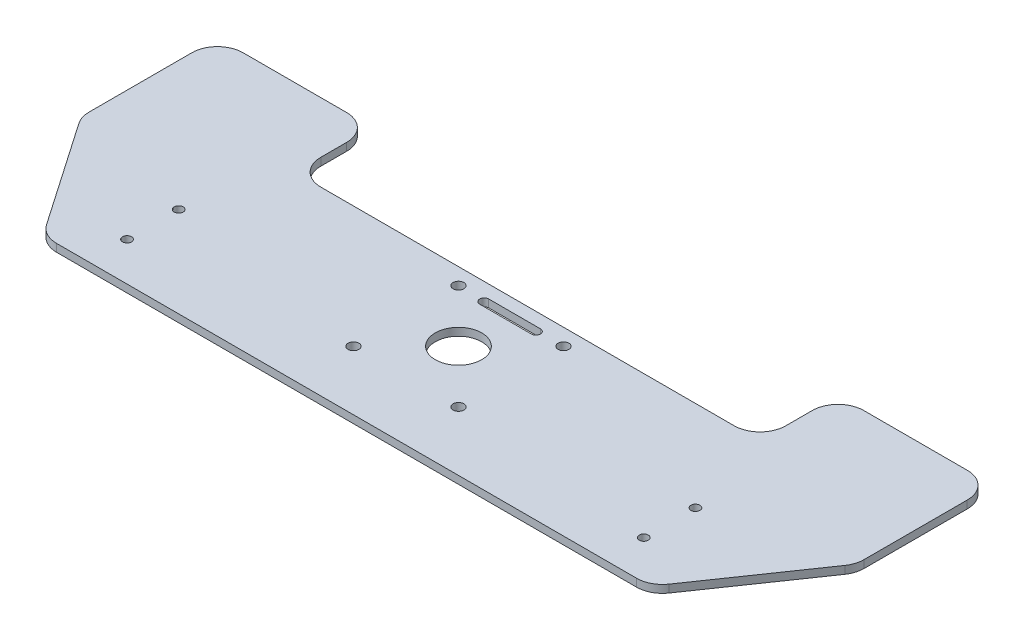
ISO-10303-21;
HEADER;
FILE_DESCRIPTION(('STEP AP214'),'2;1');
FILE_NAME('part.step','',(''),(''),'','','');
FILE_SCHEMA(('AUTOMOTIVE_DESIGN { 1 0 10303 214 1 1 1 1 }'));
ENDSEC;
DATA;
#1=APPLICATION_CONTEXT('core data for automotive mechanical design processes');
#2=APPLICATION_PROTOCOL_DEFINITION('international standard','automotive_design',2000,#1);
#3=PRODUCT_CONTEXT('',#1,'mechanical');
#4=PRODUCT('Part','Part','',(#3));
#5=PRODUCT_RELATED_PRODUCT_CATEGORY('part','',(#4));
#6=PRODUCT_DEFINITION_FORMATION('','',#4);
#7=PRODUCT_DEFINITION_CONTEXT('part definition',#1,'design');
#8=PRODUCT_DEFINITION('design','',#6,#7);
#9=PRODUCT_DEFINITION_SHAPE('','',#8);
#10=(LENGTH_UNIT() NAMED_UNIT(*) SI_UNIT(.MILLI.,.METRE.));
#11=(NAMED_UNIT(*) PLANE_ANGLE_UNIT() SI_UNIT($,.RADIAN.));
#12=(NAMED_UNIT(*) SI_UNIT($,.STERADIAN.) SOLID_ANGLE_UNIT());
#13=UNCERTAINTY_MEASURE_WITH_UNIT(LENGTH_MEASURE(1.E-05),#10,'distance_accuracy_value','');
#14=(GEOMETRIC_REPRESENTATION_CONTEXT(3) GLOBAL_UNCERTAINTY_ASSIGNED_CONTEXT((#13)) GLOBAL_UNIT_ASSIGNED_CONTEXT((#10,
#11,#12)) REPRESENTATION_CONTEXT('',''));
#15=CARTESIAN_POINT('',(0.,0.,0.));
#16=DIRECTION('',(0.,0.,1.));
#17=DIRECTION('',(1.,0.,0.));
#18=AXIS2_PLACEMENT_3D('',#15,#16,#17);
#19=CARTESIAN_POINT('',(112.256301560113,3.,15.0991936427522));
#20=DIRECTION('',(0.,-1.,0.));
#21=DIRECTION('',(0.,0.,-1.));
#22=AXIS2_PLACEMENT_3D('',#19,#20,#21);
#23=CYLINDRICAL_SURFACE('',#22,9.99999999999999);
#24=CARTESIAN_POINT('',(112.256301560113,0.,15.0991936427522));
#25=DIRECTION('',(0.,1.,0.));
#26=DIRECTION('',(0.,0.,-1.));
#27=AXIS2_PLACEMENT_3D('',#24,#25,#26);
#28=CIRCLE('',#27,9.99999999999999);
#29=CARTESIAN_POINT('',(112.256301560113,0.,25.0991936427522));
#30=VERTEX_POINT('',#29);
#31=CARTESIAN_POINT('',(120.492131082074,0.,20.7711520422126));
#32=VERTEX_POINT('',#31);
#33=EDGE_CURVE('E300',#30,#32,#28,.T.);
#34=ORIENTED_EDGE('',*,*,#33,.T.);
#35=DIRECTION('',(0.,-1.,0.));
#36=VECTOR('',#35,1.);
#37=CARTESIAN_POINT('',(120.492131082074,3.,20.7711520422126));
#38=LINE('',#37,#36);
#39=CARTESIAN_POINT('',(120.492131082074,3.,20.7711520422126));
#40=VERTEX_POINT('',#39);
#41=EDGE_CURVE('E11',#40,#32,#38,.T.);
#42=ORIENTED_EDGE('',*,*,#41,.F.);
#43=CARTESIAN_POINT('',(112.256301560113,3.,15.0991936427522));
#44=DIRECTION('',(0.,1.,0.));
#45=DIRECTION('',(0.,0.,-1.));
#46=AXIS2_PLACEMENT_3D('',#43,#44,#45);
#47=CIRCLE('',#46,9.99999999999999);
#48=CARTESIAN_POINT('',(112.256301560113,3.,25.0991936427522));
#49=VERTEX_POINT('',#48);
#50=EDGE_CURVE('E257',#49,#40,#47,.T.);
#51=ORIENTED_EDGE('',*,*,#50,.F.);
#52=DIRECTION('',(0.,-1.,0.));
#53=VECTOR('',#52,1.);
#54=CARTESIAN_POINT('',(112.256301560113,3.,25.0991936427522));
#55=LINE('',#54,#53);
#56=EDGE_CURVE('E299',#49,#30,#55,.T.);
#57=ORIENTED_EDGE('',*,*,#56,.T.);
#58=EDGE_LOOP('',(#34,#42,#51,#57));
#59=FACE_BOUND('',#58,.T.);
#60=ADVANCED_FACE('F43',(#59),#23,.T.);
#61=CARTESIAN_POINT('',(148.23582952196,3.,-19.5134118716057));
#62=DIRECTION('',(-0.823582952196019,0.,-0.567195839946037));
#63=DIRECTION('',(-0.567195839946037,0.,0.823582952196019));
#64=AXIS2_PLACEMENT_3D('',#61,#62,#63);
#65=PLANE('',#64);
#66=DIRECTION('',(0.567195839946037,0.,-0.823582952196019));
#67=VECTOR('',#66,1.);
#68=CARTESIAN_POINT('',(148.23582952196,0.,-19.5134118716057));
#69=LINE('',#68,#67);
#70=CARTESIAN_POINT('',(148.23582952196,0.,-19.5134118716057));
#71=VERTEX_POINT('',#70);
#72=EDGE_CURVE('E303',#32,#71,#69,.T.);
#73=ORIENTED_EDGE('',*,*,#72,.T.);
#74=DIRECTION('',(0.,-1.,0.));
#75=VECTOR('',#74,1.);
#76=CARTESIAN_POINT('',(148.23582952196,3.,-19.5134118716057));
#77=LINE('',#76,#75);
#78=CARTESIAN_POINT('',(148.23582952196,3.,-19.5134118716057));
#79=VERTEX_POINT('',#78);
#80=EDGE_CURVE('E51',#79,#71,#77,.T.);
#81=ORIENTED_EDGE('',*,*,#80,.F.);
#82=DIRECTION('',(0.567195839946037,0.,-0.823582952196019));
#83=VECTOR('',#82,1.);
#84=CARTESIAN_POINT('',(148.23582952196,3.,-19.5134118716057));
#85=LINE('',#84,#83);
#86=EDGE_CURVE('E260',#40,#79,#85,.T.);
#87=ORIENTED_EDGE('',*,*,#86,.F.);
#88=ORIENTED_EDGE('',*,*,#41,.T.);
#89=EDGE_LOOP('',(#73,#81,#87,#88));
#90=FACE_BOUND('',#89,.T.);
#91=ADVANCED_FACE('F516',(#90),#65,.F.);
#92=CARTESIAN_POINT('',(140.,3.,-25.1853702710659));
#93=DIRECTION('',(0.,-1.,0.));
#94=DIRECTION('',(0.,0.,-1.));
#95=AXIS2_PLACEMENT_3D('',#92,#93,#94);
#96=CYLINDRICAL_SURFACE('',#95,10.);
#97=CARTESIAN_POINT('',(140.,0.,-25.1853702710659));
#98=DIRECTION('',(0.,1.,0.));
#99=DIRECTION('',(0.,0.,1.));
#100=AXIS2_PLACEMENT_3D('',#97,#98,#99);
#101=CIRCLE('',#100,10.);
#102=CARTESIAN_POINT('',(150.,0.,-25.1853702710661));
#103=VERTEX_POINT('',#102);
#104=EDGE_CURVE('E306',#71,#103,#101,.T.);
#105=ORIENTED_EDGE('',*,*,#104,.T.);
#106=DIRECTION('',(0.,-1.,0.));
#107=VECTOR('',#106,1.);
#108=CARTESIAN_POINT('',(150.,3.,-25.1853702710661));
#109=LINE('',#108,#107);
#110=CARTESIAN_POINT('',(150.,3.,-25.1853702710661));
#111=VERTEX_POINT('',#110);
#112=EDGE_CURVE('E391',#111,#103,#109,.T.);
#113=ORIENTED_EDGE('',*,*,#112,.F.);
#114=CARTESIAN_POINT('',(140.,3.,-25.1853702710659));
#115=DIRECTION('',(0.,1.,0.));
#116=DIRECTION('',(0.,0.,1.));
#117=AXIS2_PLACEMENT_3D('',#114,#115,#116);
#118=CIRCLE('',#117,10.);
#119=EDGE_CURVE('E263',#79,#111,#118,.T.);
#120=ORIENTED_EDGE('',*,*,#119,.F.);
#121=ORIENTED_EDGE('',*,*,#80,.T.);
#122=EDGE_LOOP('',(#105,#113,#120,#121));
#123=FACE_BOUND('',#122,.T.);
#124=ADVANCED_FACE('F512',(#123),#96,.T.);
#125=CARTESIAN_POINT('',(150.,3.,-25.1853702710661));
#126=DIRECTION('',(-1.,0.,0.));
#127=DIRECTION('',(0.,0.,1.));
#128=AXIS2_PLACEMENT_3D('',#125,#126,#127);
#129=PLANE('',#128);
#130=DIRECTION('',(0.,0.,-1.));
#131=VECTOR('',#130,1.);
#132=CARTESIAN_POINT('',(150.,0.,-25.1853702710661));
#133=LINE('',#132,#131);
#134=CARTESIAN_POINT('',(150.,0.,-64.9999999999999));
#135=VERTEX_POINT('',#134);
#136=EDGE_CURVE('E308',#103,#135,#133,.T.);
#137=ORIENTED_EDGE('',*,*,#136,.T.);
#138=DIRECTION('',(0.,-1.,0.));
#139=VECTOR('',#138,1.);
#140=CARTESIAN_POINT('',(150.,3.,-64.9999999999999));
#141=LINE('',#140,#139);
#142=CARTESIAN_POINT('',(150.,3.,-64.9999999999999));
#143=VERTEX_POINT('',#142);
#144=EDGE_CURVE('E388',#143,#135,#141,.T.);
#145=ORIENTED_EDGE('',*,*,#144,.F.);
#146=DIRECTION('',(0.,0.,-1.));
#147=VECTOR('',#146,1.);
#148=CARTESIAN_POINT('',(150.,3.,-25.1853702710661));
#149=LINE('',#148,#147);
#150=EDGE_CURVE('E265',#111,#143,#149,.T.);
#151=ORIENTED_EDGE('',*,*,#150,.F.);
#152=ORIENTED_EDGE('',*,*,#112,.T.);
#153=EDGE_LOOP('',(#137,#145,#151,#152));
#154=FACE_BOUND('',#153,.T.);
#155=ADVANCED_FACE('F509',(#154),#129,.F.);
#156=CARTESIAN_POINT('',(140.101052956192,3.,-65.1918696109306));
#157=DIRECTION('',(0.,-1.,0.));
#158=DIRECTION('',(0.,0.,-1.));
#159=AXIS2_PLACEMENT_3D('',#156,#157,#158);
#160=CYLINDRICAL_SURFACE('',#159,9.90080635724788);
#161=CARTESIAN_POINT('',(140.101052956192,0.,-65.1918696109306));
#162=DIRECTION('',(0.,1.,0.));
#163=DIRECTION('',(0.,0.,1.));
#164=AXIS2_PLACEMENT_3D('',#161,#162,#163);
#165=CIRCLE('',#164,9.90080635724788);
#166=CARTESIAN_POINT('',(140.101052960808,0.,-75.0926759681785));
#167=VERTEX_POINT('',#166);
#168=EDGE_CURVE('E310',#135,#167,#165,.T.);
#169=ORIENTED_EDGE('',*,*,#168,.T.);
#170=DIRECTION('',(0.,-1.,0.));
#171=VECTOR('',#170,1.);
#172=CARTESIAN_POINT('',(140.101052960808,3.,-75.0926759681785));
#173=LINE('',#172,#171);
#174=CARTESIAN_POINT('',(140.101052960808,3.,-75.0926759681785));
#175=VERTEX_POINT('',#174);
#176=EDGE_CURVE('E385',#175,#167,#173,.T.);
#177=ORIENTED_EDGE('',*,*,#176,.F.);
#178=CARTESIAN_POINT('',(140.101052956192,3.,-65.1918696109306));
#179=DIRECTION('',(0.,1.,0.));
#180=DIRECTION('',(0.,0.,1.));
#181=AXIS2_PLACEMENT_3D('',#178,#179,#180);
#182=CIRCLE('',#181,9.90080635724788);
#183=EDGE_CURVE('E267',#143,#175,#182,.T.);
#184=ORIENTED_EDGE('',*,*,#183,.F.);
#185=ORIENTED_EDGE('',*,*,#144,.T.);
#186=EDGE_LOOP('',(#169,#177,#184,#185));
#187=FACE_BOUND('',#186,.T.);
#188=ADVANCED_FACE('F505',(#187),#160,.T.);
#189=CARTESIAN_POINT('',(140.101052960808,3.,-75.0926759681785));
#190=DIRECTION('',(0.,0.,1.));
#191=DIRECTION('',(1.,0.,0.));
#192=AXIS2_PLACEMENT_3D('',#189,#190,#191);
#193=PLANE('',#192);
#194=DIRECTION('',(-1.,0.,0.));
#195=VECTOR('',#194,1.);
#196=CARTESIAN_POINT('',(140.101052960808,0.,-75.0926759681785));
#197=LINE('',#196,#195);
#198=CARTESIAN_POINT('',(100.001859318056,0.,-75.0926759681785));
#199=VERTEX_POINT('',#198);
#200=EDGE_CURVE('E312',#167,#199,#197,.T.);
#201=ORIENTED_EDGE('',*,*,#200,.T.);
#202=DIRECTION('',(0.,-1.,0.));
#203=VECTOR('',#202,1.);
#204=CARTESIAN_POINT('',(100.001859318056,3.,-75.0926759681785));
#205=LINE('',#204,#203);
#206=CARTESIAN_POINT('',(100.001859318056,3.,-75.0926759681785));
#207=VERTEX_POINT('',#206);
#208=EDGE_CURVE('E382',#207,#199,#205,.T.);
#209=ORIENTED_EDGE('',*,*,#208,.F.);
#210=DIRECTION('',(-1.,0.,0.));
#211=VECTOR('',#210,1.);
#212=CARTESIAN_POINT('',(140.101052960808,3.,-75.0926759681785));
#213=LINE('',#212,#211);
#214=EDGE_CURVE('E269',#175,#207,#213,.T.);
#215=ORIENTED_EDGE('',*,*,#214,.F.);
#216=ORIENTED_EDGE('',*,*,#176,.T.);
#217=EDGE_LOOP('',(#201,#209,#215,#216));
#218=FACE_BOUND('',#217,.T.);
#219=ADVANCED_FACE('F500',(#218),#193,.F.);
#220=CARTESIAN_POINT('',(99.9981591200433,3.,-65.0926766527517));
#221=DIRECTION('',(0.,-1.,0.));
#222=DIRECTION('',(0.,0.,-1.));
#223=AXIS2_PLACEMENT_3D('',#220,#221,#222);
#224=CYLINDRICAL_SURFACE('',#223,10.);
#225=CARTESIAN_POINT('',(99.9981591200433,0.,-65.0926766527517));
#226=DIRECTION('',(0.,1.,0.));
#227=DIRECTION('',(0.,0.,-1.));
#228=AXIS2_PLACEMENT_3D('',#225,#226,#227);
#229=CIRCLE('',#228,10.);
#230=CARTESIAN_POINT('',(90.,0.,-64.9008063572478));
#231=VERTEX_POINT('',#230);
#232=EDGE_CURVE('E314',#199,#231,#229,.T.);
#233=ORIENTED_EDGE('',*,*,#232,.T.);
#234=DIRECTION('',(0.,-1.,0.));
#235=VECTOR('',#234,1.);
#236=CARTESIAN_POINT('',(90.,3.,-64.9008063572478));
#237=LINE('',#236,#235);
#238=CARTESIAN_POINT('',(90.,3.,-64.9008063572478));
#239=VERTEX_POINT('',#238);
#240=EDGE_CURVE('E379',#239,#231,#237,.T.);
#241=ORIENTED_EDGE('',*,*,#240,.F.);
#242=CARTESIAN_POINT('',(99.9981591200433,3.,-65.0926766527517));
#243=DIRECTION('',(0.,1.,0.));
#244=DIRECTION('',(0.,0.,-1.));
#245=AXIS2_PLACEMENT_3D('',#242,#243,#244);
#246=CIRCLE('',#245,10.);
#247=EDGE_CURVE('E271',#207,#239,#246,.T.);
#248=ORIENTED_EDGE('',*,*,#247,.F.);
#249=ORIENTED_EDGE('',*,*,#208,.T.);
#250=EDGE_LOOP('',(#233,#241,#248,#249));
#251=FACE_BOUND('',#250,.T.);
#252=ADVANCED_FACE('F494',(#251),#224,.T.);
#253=CARTESIAN_POINT('',(90.,3.,-64.9008063572478));
#254=DIRECTION('',(1.,0.,0.));
#255=DIRECTION('',(0.,0.,-1.));
#256=AXIS2_PLACEMENT_3D('',#253,#254,#255);
#257=PLANE('',#256);
#258=DIRECTION('',(0.,0.,1.));
#259=VECTOR('',#258,1.);
#260=CARTESIAN_POINT('',(90.,0.,-64.9008063572478));
#261=LINE('',#260,#259);
#262=CARTESIAN_POINT('',(90.,0.,-54.9008063572479));
#263=VERTEX_POINT('',#262);
#264=EDGE_CURVE('E316',#231,#263,#261,.T.);
#265=ORIENTED_EDGE('',*,*,#264,.T.);
#266=DIRECTION('',(0.,-1.,0.));
#267=VECTOR('',#266,1.);
#268=CARTESIAN_POINT('',(90.,3.,-54.9008063572479));
#269=LINE('',#268,#267);
#270=CARTESIAN_POINT('',(90.,3.,-54.9008063572479));
#271=VERTEX_POINT('',#270);
#272=EDGE_CURVE('E376',#271,#263,#269,.T.);
#273=ORIENTED_EDGE('',*,*,#272,.F.);
#274=DIRECTION('',(0.,0.,1.));
#275=VECTOR('',#274,1.);
#276=CARTESIAN_POINT('',(90.,3.,-64.9008063572478));
#277=LINE('',#276,#275);
#278=EDGE_CURVE('E273',#239,#271,#277,.T.);
#279=ORIENTED_EDGE('',*,*,#278,.F.);
#280=ORIENTED_EDGE('',*,*,#240,.T.);
#281=EDGE_LOOP('',(#265,#273,#279,#280));
#282=FACE_BOUND('',#281,.T.);
#283=ADVANCED_FACE('F490',(#282),#257,.F.);
#284=CARTESIAN_POINT('',(80.,3.,-54.9008063572479));
#285=DIRECTION('',(0.,-1.,0.));
#286=DIRECTION('',(0.,0.,-1.));
#287=AXIS2_PLACEMENT_3D('',#284,#285,#286);
#288=CYLINDRICAL_SURFACE('',#287,10.);
#289=CARTESIAN_POINT('',(80.,0.,-54.9008063572479));
#290=DIRECTION('',(0.,-1.,0.));
#291=DIRECTION('',(0.,0.,-1.));
#292=AXIS2_PLACEMENT_3D('',#289,#290,#291);
#293=CIRCLE('',#292,10.);
#294=CARTESIAN_POINT('',(80.,0.,-44.9008063572478));
#295=VERTEX_POINT('',#294);
#296=EDGE_CURVE('E318',#263,#295,#293,.T.);
#297=ORIENTED_EDGE('',*,*,#296,.T.);
#298=DIRECTION('',(0.,-1.,0.));
#299=VECTOR('',#298,1.);
#300=CARTESIAN_POINT('',(80.,3.,-44.9008063572478));
#301=LINE('',#300,#299);
#302=CARTESIAN_POINT('',(80.,3.,-44.9008063572478));
#303=VERTEX_POINT('',#302);
#304=EDGE_CURVE('E373',#303,#295,#301,.T.);
#305=ORIENTED_EDGE('',*,*,#304,.F.);
#306=CARTESIAN_POINT('',(80.,3.,-54.9008063572479));
#307=DIRECTION('',(0.,-1.,0.));
#308=DIRECTION('',(0.,0.,-1.));
#309=AXIS2_PLACEMENT_3D('',#306,#307,#308);
#310=CIRCLE('',#309,10.);
#311=EDGE_CURVE('E275',#271,#303,#310,.T.);
#312=ORIENTED_EDGE('',*,*,#311,.F.);
#313=ORIENTED_EDGE('',*,*,#272,.T.);
#314=EDGE_LOOP('',(#297,#305,#312,#313));
#315=FACE_BOUND('',#314,.T.);
#316=ADVANCED_FACE('F485',(#315),#288,.F.);
#317=CARTESIAN_POINT('',(-79.9999999999999,3.,-44.9008063572478));
#318=DIRECTION('',(0.,0.,1.));
#319=DIRECTION('',(1.,0.,0.));
#320=AXIS2_PLACEMENT_3D('',#317,#318,#319);
#321=PLANE('',#320);
#322=DIRECTION('',(-1.,0.,0.));
#323=VECTOR('',#322,1.);
#324=CARTESIAN_POINT('',(-79.9999999999999,0.,-44.9008063572478));
#325=LINE('',#324,#323);
#326=CARTESIAN_POINT('',(-79.9999999999999,0.,-44.9008063572478));
#327=VERTEX_POINT('',#326);
#328=EDGE_CURVE('E320',#295,#327,#325,.T.);
#329=ORIENTED_EDGE('',*,*,#328,.T.);
#330=DIRECTION('',(0.,-1.,0.));
#331=VECTOR('',#330,1.);
#332=CARTESIAN_POINT('',(-79.9999999999999,3.,-44.9008063572478));
#333=LINE('',#332,#331);
#334=CARTESIAN_POINT('',(-79.9999999999999,3.,-44.9008063572478));
#335=VERTEX_POINT('',#334);
#336=EDGE_CURVE('E370',#335,#327,#333,.T.);
#337=ORIENTED_EDGE('',*,*,#336,.F.);
#338=DIRECTION('',(-1.,0.,0.));
#339=VECTOR('',#338,1.);
#340=CARTESIAN_POINT('',(-79.9999999999999,3.,-44.9008063572478));
#341=LINE('',#340,#339);
#342=EDGE_CURVE('E277',#303,#335,#341,.T.);
#343=ORIENTED_EDGE('',*,*,#342,.F.);
#344=ORIENTED_EDGE('',*,*,#304,.T.);
#345=EDGE_LOOP('',(#329,#337,#343,#344));
#346=FACE_BOUND('',#345,.T.);
#347=ADVANCED_FACE('F479',(#346),#321,.F.);
#348=CARTESIAN_POINT('',(-79.9999999999999,3.,-54.9008063572479));
#349=DIRECTION('',(0.,-1.,0.));
#350=DIRECTION('',(0.,0.,-1.));
#351=AXIS2_PLACEMENT_3D('',#348,#349,#350);
#352=CYLINDRICAL_SURFACE('',#351,10.);
#353=CARTESIAN_POINT('',(-79.9999999999999,0.,-54.9008063572479));
#354=DIRECTION('',(0.,-1.,0.));
#355=DIRECTION('',(0.,0.,1.));
#356=AXIS2_PLACEMENT_3D('',#353,#354,#355);
#357=CIRCLE('',#356,10.);
#358=CARTESIAN_POINT('',(-90.,0.,-54.9008063572479));
#359=VERTEX_POINT('',#358);
#360=EDGE_CURVE('E322',#327,#359,#357,.T.);
#361=ORIENTED_EDGE('',*,*,#360,.T.);
#362=DIRECTION('',(0.,-1.,0.));
#363=VECTOR('',#362,1.);
#364=CARTESIAN_POINT('',(-90.,3.,-54.9008063572479));
#365=LINE('',#364,#363);
#366=CARTESIAN_POINT('',(-90.,3.,-54.9008063572479));
#367=VERTEX_POINT('',#366);
#368=EDGE_CURVE('E367',#367,#359,#365,.T.);
#369=ORIENTED_EDGE('',*,*,#368,.F.);
#370=CARTESIAN_POINT('',(-79.9999999999999,3.,-54.9008063572479));
#371=DIRECTION('',(0.,-1.,0.));
#372=DIRECTION('',(0.,0.,1.));
#373=AXIS2_PLACEMENT_3D('',#370,#371,#372);
#374=CIRCLE('',#373,10.);
#375=EDGE_CURVE('E279',#335,#367,#374,.T.);
#376=ORIENTED_EDGE('',*,*,#375,.F.);
#377=ORIENTED_EDGE('',*,*,#336,.T.);
#378=EDGE_LOOP('',(#361,#369,#376,#377));
#379=FACE_BOUND('',#378,.T.);
#380=ADVANCED_FACE('F475',(#379),#352,.F.);
#381=CARTESIAN_POINT('',(-90.,3.,-64.9008063572478));
#382=DIRECTION('',(-1.,0.,0.));
#383=DIRECTION('',(0.,0.,1.));
#384=AXIS2_PLACEMENT_3D('',#381,#382,#383);
#385=PLANE('',#384);
#386=DIRECTION('',(0.,0.,-1.));
#387=VECTOR('',#386,1.);
#388=CARTESIAN_POINT('',(-90.,0.,-64.9008063572478));
#389=LINE('',#388,#387);
#390=CARTESIAN_POINT('',(-90.,0.,-64.9008063572478));
#391=VERTEX_POINT('',#390);
#392=EDGE_CURVE('E324',#359,#391,#389,.T.);
#393=ORIENTED_EDGE('',*,*,#392,.T.);
#394=DIRECTION('',(0.,-1.,0.));
#395=VECTOR('',#394,1.);
#396=CARTESIAN_POINT('',(-90.,3.,-64.9008063572478));
#397=LINE('',#396,#395);
#398=CARTESIAN_POINT('',(-90.,3.,-64.9008063572478));
#399=VERTEX_POINT('',#398);
#400=EDGE_CURVE('E364',#399,#391,#397,.T.);
#401=ORIENTED_EDGE('',*,*,#400,.F.);
#402=DIRECTION('',(0.,0.,-1.));
#403=VECTOR('',#402,1.);
#404=CARTESIAN_POINT('',(-90.,3.,-64.9008063572478));
#405=LINE('',#404,#403);
#406=EDGE_CURVE('E281',#367,#399,#405,.T.);
#407=ORIENTED_EDGE('',*,*,#406,.F.);
#408=ORIENTED_EDGE('',*,*,#368,.T.);
#409=EDGE_LOOP('',(#393,#401,#407,#408));
#410=FACE_BOUND('',#409,.T.);
#411=ADVANCED_FACE('F470',(#410),#385,.F.);
#412=CARTESIAN_POINT('',(-100.,3.,-64.9008063572478));
#413=DIRECTION('',(0.,-1.,0.));
#414=DIRECTION('',(0.,0.,-1.));
#415=AXIS2_PLACEMENT_3D('',#412,#413,#414);
#416=CYLINDRICAL_SURFACE('',#415,10.);
#417=CARTESIAN_POINT('',(-100.,0.,-64.9008063572478));
#418=DIRECTION('',(0.,1.,0.));
#419=DIRECTION('',(0.,0.,1.));
#420=AXIS2_PLACEMENT_3D('',#417,#418,#419);
#421=CIRCLE('',#420,10.);
#422=CARTESIAN_POINT('',(-100.,0.,-74.9008063572478));
#423=VERTEX_POINT('',#422);
#424=EDGE_CURVE('E326',#391,#423,#421,.T.);
#425=ORIENTED_EDGE('',*,*,#424,.T.);
#426=DIRECTION('',(0.,-1.,0.));
#427=VECTOR('',#426,1.);
#428=CARTESIAN_POINT('',(-100.,3.,-74.9008063572478));
#429=LINE('',#428,#427);
#430=CARTESIAN_POINT('',(-100.,3.,-74.9008063572478));
#431=VERTEX_POINT('',#430);
#432=EDGE_CURVE('E361',#431,#423,#429,.T.);
#433=ORIENTED_EDGE('',*,*,#432,.F.);
#434=CARTESIAN_POINT('',(-100.,3.,-64.9008063572478));
#435=DIRECTION('',(0.,1.,0.));
#436=DIRECTION('',(0.,0.,1.));
#437=AXIS2_PLACEMENT_3D('',#434,#435,#436);
#438=CIRCLE('',#437,10.);
#439=EDGE_CURVE('E283',#399,#431,#438,.T.);
#440=ORIENTED_EDGE('',*,*,#439,.F.);
#441=ORIENTED_EDGE('',*,*,#400,.T.);
#442=EDGE_LOOP('',(#425,#433,#440,#441));
#443=FACE_BOUND('',#442,.T.);
#444=ADVANCED_FACE('F464',(#443),#416,.T.);
#445=CARTESIAN_POINT('',(-140.099193642752,3.,-74.9008063572478));
#446=DIRECTION('',(0.,0.,1.));
#447=DIRECTION('',(1.,0.,0.));
#448=AXIS2_PLACEMENT_3D('',#445,#446,#447);
#449=PLANE('',#448);
#450=DIRECTION('',(-1.,0.,0.));
#451=VECTOR('',#450,1.);
#452=CARTESIAN_POINT('',(-140.099193642752,0.,-74.9008063572478));
#453=LINE('',#452,#451);
#454=CARTESIAN_POINT('',(-140.099193642752,0.,-74.9008063572478));
#455=VERTEX_POINT('',#454);
#456=EDGE_CURVE('E328',#423,#455,#453,.T.);
#457=ORIENTED_EDGE('',*,*,#456,.T.);
#458=DIRECTION('',(0.,-1.,0.));
#459=VECTOR('',#458,1.);
#460=CARTESIAN_POINT('',(-140.099193642752,3.,-74.9008063572478));
#461=LINE('',#460,#459);
#462=CARTESIAN_POINT('',(-140.099193642752,3.,-74.9008063572478));
#463=VERTEX_POINT('',#462);
#464=EDGE_CURVE('E358',#463,#455,#461,.T.);
#465=ORIENTED_EDGE('',*,*,#464,.F.);
#466=DIRECTION('',(-1.,0.,0.));
#467=VECTOR('',#466,1.);
#468=CARTESIAN_POINT('',(-140.099193642752,3.,-74.9008063572478));
#469=LINE('',#468,#467);
#470=EDGE_CURVE('E285',#431,#463,#469,.T.);
#471=ORIENTED_EDGE('',*,*,#470,.F.);
#472=ORIENTED_EDGE('',*,*,#432,.T.);
#473=EDGE_LOOP('',(#457,#465,#471,#472));
#474=FACE_BOUND('',#473,.T.);
#475=ADVANCED_FACE('F460',(#474),#449,.F.);
#476=CARTESIAN_POINT('',(-140.099193642752,3.,-64.9999999999999));
#477=DIRECTION('',(0.,-1.,0.));
#478=DIRECTION('',(0.,0.,-1.));
#479=AXIS2_PLACEMENT_3D('',#476,#477,#478);
#480=CYLINDRICAL_SURFACE('',#479,9.90080635724788);
#481=CARTESIAN_POINT('',(-140.099193642752,0.,-64.9999999999999));
#482=DIRECTION('',(0.,1.,0.));
#483=DIRECTION('',(0.,0.,-1.));
#484=AXIS2_PLACEMENT_3D('',#481,#482,#483);
#485=CIRCLE('',#484,9.90080635724788);
#486=CARTESIAN_POINT('',(-150.,0.,-64.9999999999999));
#487=VERTEX_POINT('',#486);
#488=EDGE_CURVE('E330',#455,#487,#485,.T.);
#489=ORIENTED_EDGE('',*,*,#488,.T.);
#490=DIRECTION('',(0.,-1.,0.));
#491=VECTOR('',#490,1.);
#492=CARTESIAN_POINT('',(-150.,3.,-64.9999999999999));
#493=LINE('',#492,#491);
#494=CARTESIAN_POINT('',(-150.,3.,-64.9999999999999));
#495=VERTEX_POINT('',#494);
#496=EDGE_CURVE('E355',#495,#487,#493,.T.);
#497=ORIENTED_EDGE('',*,*,#496,.F.);
#498=CARTESIAN_POINT('',(-140.099193642752,3.,-64.9999999999999));
#499=DIRECTION('',(0.,1.,0.));
#500=DIRECTION('',(0.,0.,-1.));
#501=AXIS2_PLACEMENT_3D('',#498,#499,#500);
#502=CIRCLE('',#501,9.90080635724788);
#503=EDGE_CURVE('E287',#463,#495,#502,.T.);
#504=ORIENTED_EDGE('',*,*,#503,.F.);
#505=ORIENTED_EDGE('',*,*,#464,.T.);
#506=EDGE_LOOP('',(#489,#497,#504,#505));
#507=FACE_BOUND('',#506,.T.);
#508=ADVANCED_FACE('F455',(#507),#480,.T.);
#509=CARTESIAN_POINT('',(-150.,3.,-25.1853702710662));
#510=DIRECTION('',(1.,0.,0.));
#511=DIRECTION('',(0.,0.,-1.));
#512=AXIS2_PLACEMENT_3D('',#509,#510,#511);
#513=PLANE('',#512);
#514=DIRECTION('',(0.,0.,1.));
#515=VECTOR('',#514,1.);
#516=CARTESIAN_POINT('',(-150.,0.,-25.1853702710662));
#517=LINE('',#516,#515);
#518=CARTESIAN_POINT('',(-150.,0.,-25.1853702710662));
#519=VERTEX_POINT('',#518);
#520=EDGE_CURVE('E332',#487,#519,#517,.T.);
#521=ORIENTED_EDGE('',*,*,#520,.T.);
#522=DIRECTION('',(0.,-1.,0.));
#523=VECTOR('',#522,1.);
#524=CARTESIAN_POINT('',(-150.,3.,-25.1853702710662));
#525=LINE('',#524,#523);
#526=CARTESIAN_POINT('',(-150.,3.,-25.1853702710662));
#527=VERTEX_POINT('',#526);
#528=EDGE_CURVE('E352',#527,#519,#525,.T.);
#529=ORIENTED_EDGE('',*,*,#528,.F.);
#530=DIRECTION('',(0.,0.,1.));
#531=VECTOR('',#530,1.);
#532=CARTESIAN_POINT('',(-150.,3.,-25.1853702710662));
#533=LINE('',#532,#531);
#534=EDGE_CURVE('E289',#495,#527,#533,.T.);
#535=ORIENTED_EDGE('',*,*,#534,.F.);
#536=ORIENTED_EDGE('',*,*,#496,.T.);
#537=EDGE_LOOP('',(#521,#529,#535,#536));
#538=FACE_BOUND('',#537,.T.);
#539=ADVANCED_FACE('F449',(#538),#513,.F.);
#540=CARTESIAN_POINT('',(-140.,3.,-25.1853702710662));
#541=DIRECTION('',(0.,-1.,0.));
#542=DIRECTION('',(0.,0.,-1.));
#543=AXIS2_PLACEMENT_3D('',#540,#541,#542);
#544=CYLINDRICAL_SURFACE('',#543,10.);
#545=CARTESIAN_POINT('',(-140.,0.,-25.1853702710662));
#546=DIRECTION('',(0.,1.,0.));
#547=DIRECTION('',(0.,0.,-1.));
#548=AXIS2_PLACEMENT_3D('',#545,#546,#547);
#549=CIRCLE('',#548,10.);
#550=CARTESIAN_POINT('',(-148.23582952196,0.,-19.5134118716058));
#551=VERTEX_POINT('',#550);
#552=EDGE_CURVE('E334',#519,#551,#549,.T.);
#553=ORIENTED_EDGE('',*,*,#552,.T.);
#554=DIRECTION('',(0.,-1.,0.));
#555=VECTOR('',#554,1.);
#556=CARTESIAN_POINT('',(-148.23582952196,3.,-19.5134118716058));
#557=LINE('',#556,#555);
#558=CARTESIAN_POINT('',(-148.23582952196,3.,-19.5134118716058));
#559=VERTEX_POINT('',#558);
#560=EDGE_CURVE('E349',#559,#551,#557,.T.);
#561=ORIENTED_EDGE('',*,*,#560,.F.);
#562=CARTESIAN_POINT('',(-140.,3.,-25.1853702710662));
#563=DIRECTION('',(0.,1.,0.));
#564=DIRECTION('',(0.,0.,-1.));
#565=AXIS2_PLACEMENT_3D('',#562,#563,#564);
#566=CIRCLE('',#565,10.);
#567=EDGE_CURVE('E291',#527,#559,#566,.T.);
#568=ORIENTED_EDGE('',*,*,#567,.F.);
#569=ORIENTED_EDGE('',*,*,#528,.T.);
#570=EDGE_LOOP('',(#553,#561,#568,#569));
#571=FACE_BOUND('',#570,.T.);
#572=ADVANCED_FACE('F445',(#571),#544,.T.);
#573=CARTESIAN_POINT('',(-148.23582952196,3.,-19.5134118716058));
#574=DIRECTION('',(0.82358295219602,0.,-0.567195839946035));
#575=DIRECTION('',(-0.567195839946035,0.,-0.82358295219602));
#576=AXIS2_PLACEMENT_3D('',#573,#574,#575);
#577=PLANE('',#576);
#578=DIRECTION('',(0.567195839946035,0.,0.82358295219602));
#579=VECTOR('',#578,1.);
#580=CARTESIAN_POINT('',(-148.23582952196,0.,-19.5134118716058));
#581=LINE('',#580,#579);
#582=CARTESIAN_POINT('',(-120.492131082074,0.,20.7711520422125));
#583=VERTEX_POINT('',#582);
#584=EDGE_CURVE('E336',#551,#583,#581,.T.);
#585=ORIENTED_EDGE('',*,*,#584,.T.);
#586=DIRECTION('',(0.,-1.,0.));
#587=VECTOR('',#586,1.);
#588=CARTESIAN_POINT('',(-120.492131082074,3.,20.7711520422125));
#589=LINE('',#588,#587);
#590=CARTESIAN_POINT('',(-120.492131082074,3.,20.7711520422125));
#591=VERTEX_POINT('',#590);
#592=EDGE_CURVE('E346',#591,#583,#589,.T.);
#593=ORIENTED_EDGE('',*,*,#592,.F.);
#594=DIRECTION('',(0.567195839946035,0.,0.82358295219602));
#595=VECTOR('',#594,1.);
#596=CARTESIAN_POINT('',(-148.23582952196,3.,-19.5134118716058));
#597=LINE('',#596,#595);
#598=EDGE_CURVE('E293',#559,#591,#597,.T.);
#599=ORIENTED_EDGE('',*,*,#598,.F.);
#600=ORIENTED_EDGE('',*,*,#560,.T.);
#601=EDGE_LOOP('',(#585,#593,#599,#600));
#602=FACE_BOUND('',#601,.T.);
#603=ADVANCED_FACE('F440',(#602),#577,.F.);
#604=CARTESIAN_POINT('',(-112.256301560113,3.,15.0991936427522));
#605=DIRECTION('',(0.,-1.,0.));
#606=DIRECTION('',(0.,0.,-1.));
#607=AXIS2_PLACEMENT_3D('',#604,#605,#606);
#608=CYLINDRICAL_SURFACE('',#607,10.);
#609=CARTESIAN_POINT('',(-112.256301560113,0.,15.0991936427522));
#610=DIRECTION('',(0.,1.,0.));
#611=DIRECTION('',(0.,0.,1.));
#612=AXIS2_PLACEMENT_3D('',#609,#610,#611);
#613=CIRCLE('',#612,10.);
#614=CARTESIAN_POINT('',(-112.256301560113,0.,25.0991936427522));
#615=VERTEX_POINT('',#614);
#616=EDGE_CURVE('E338',#583,#615,#613,.T.);
#617=ORIENTED_EDGE('',*,*,#616,.T.);
#618=DIRECTION('',(0.,-1.,0.));
#619=VECTOR('',#618,1.);
#620=CARTESIAN_POINT('',(-112.256301560113,3.,25.0991936427522));
#621=LINE('',#620,#619);
#622=CARTESIAN_POINT('',(-112.256301560113,3.,25.0991936427522));
#623=VERTEX_POINT('',#622);
#624=EDGE_CURVE('E343',#623,#615,#621,.T.);
#625=ORIENTED_EDGE('',*,*,#624,.F.);
#626=CARTESIAN_POINT('',(-112.256301560113,3.,15.0991936427522));
#627=DIRECTION('',(0.,1.,0.));
#628=DIRECTION('',(0.,0.,1.));
#629=AXIS2_PLACEMENT_3D('',#626,#627,#628);
#630=CIRCLE('',#629,10.);
#631=EDGE_CURVE('E295',#591,#623,#630,.T.);
#632=ORIENTED_EDGE('',*,*,#631,.F.);
#633=ORIENTED_EDGE('',*,*,#592,.T.);
#634=EDGE_LOOP('',(#617,#625,#632,#633));
#635=FACE_BOUND('',#634,.T.);
#636=ADVANCED_FACE('F434',(#635),#608,.T.);
#637=CARTESIAN_POINT('',(-112.256301560113,3.,25.0991936427522));
#638=DIRECTION('',(0.,0.,-1.));
#639=DIRECTION('',(-1.,0.,0.));
#640=AXIS2_PLACEMENT_3D('',#637,#638,#639);
#641=PLANE('',#640);
#642=DIRECTION('',(1.,0.,0.));
#643=VECTOR('',#642,1.);
#644=CARTESIAN_POINT('',(-112.256301560113,0.,25.0991936427522));
#645=LINE('',#644,#643);
#646=EDGE_CURVE('E261',#615,#30,#645,.T.);
#647=ORIENTED_EDGE('',*,*,#646,.T.);
#648=ORIENTED_EDGE('',*,*,#56,.F.);
#649=DIRECTION('',(1.,0.,0.));
#650=VECTOR('',#649,1.);
#651=CARTESIAN_POINT('',(-112.256301560113,3.,25.0991936427522));
#652=LINE('',#651,#650);
#653=EDGE_CURVE('E297',#623,#49,#652,.T.);
#654=ORIENTED_EDGE('',*,*,#653,.F.);
#655=ORIENTED_EDGE('',*,*,#624,.T.);
#656=EDGE_LOOP('',(#647,#648,#654,#655));
#657=FACE_BOUND('',#656,.T.);
#658=ADVANCED_FACE('F430',(#657),#641,.F.);
#659=CARTESIAN_POINT('',(112.256301560113,3.,15.0991936427522));
#660=DIRECTION('',(0.,-1.,0.));
#661=DIRECTION('',(0.,0.,-1.));
#662=AXIS2_PLACEMENT_3D('',#659,#660,#661);
#663=PLANE('',#662);
#664=CARTESIAN_POINT('',(-20.3234595783914,3.,-38.5085371831278));
#665=DIRECTION('',(0.,-1.,0.));
#666=DIRECTION('',(0.,0.,-1.));
#667=AXIS2_PLACEMENT_3D('',#664,#665,#666);
#668=CIRCLE('',#667,2.1);
#669=CARTESIAN_POINT('',(-20.3234595783914,3.,-40.6085371831278));
#670=VERTEX_POINT('',#669);
#671=EDGE_CURVE('E890',#670,#670,#668,.T.);
#672=ORIENTED_EDGE('',*,*,#671,.T.);
#673=EDGE_LOOP('',(#672));
#674=FACE_BOUND('',#673,.T.);
#675=CARTESIAN_POINT('',(20.3234595783921,3.,-38.5085371831277));
#676=DIRECTION('',(0.,-1.,0.));
#677=DIRECTION('',(0.,0.,-1.));
#678=AXIS2_PLACEMENT_3D('',#675,#676,#677);
#679=CIRCLE('',#678,2.1);
#680=CARTESIAN_POINT('',(20.3234595783921,3.,-40.6085371831277));
#681=VERTEX_POINT('',#680);
#682=EDGE_CURVE('E891',#681,#681,#679,.T.);
#683=ORIENTED_EDGE('',*,*,#682,.T.);
#684=EDGE_LOOP('',(#683));
#685=FACE_BOUND('',#684,.T.);
#686=CARTESIAN_POINT('',(20.3234595783919,3.,2.13838197365574));
#687=DIRECTION('',(0.,-1.,0.));
#688=DIRECTION('',(0.,0.,-1.));
#689=AXIS2_PLACEMENT_3D('',#686,#687,#688);
#690=CIRCLE('',#689,2.1);
#691=CARTESIAN_POINT('',(20.3234595783919,3.,0.0383819736557399));
#692=VERTEX_POINT('',#691);
#693=EDGE_CURVE('E894',#692,#692,#690,.T.);
#694=ORIENTED_EDGE('',*,*,#693,.T.);
#695=EDGE_LOOP('',(#694));
#696=FACE_BOUND('',#695,.T.);
#697=CARTESIAN_POINT('',(-20.3234595783916,3.,2.13838197365542));
#698=DIRECTION('',(0.,-1.,0.));
#699=DIRECTION('',(0.,0.,-1.));
#700=AXIS2_PLACEMENT_3D('',#697,#698,#699);
#701=CIRCLE('',#700,2.1);
#702=CARTESIAN_POINT('',(-20.3234595783916,3.,0.0383819736554211));
#703=VERTEX_POINT('',#702);
#704=EDGE_CURVE('E899',#703,#703,#701,.T.);
#705=ORIENTED_EDGE('',*,*,#704,.T.);
#706=EDGE_LOOP('',(#705));
#707=FACE_BOUND('',#706,.T.);
#708=CARTESIAN_POINT('',(-2.74736830507827E-12,3.,-18.185077604737));
#709=DIRECTION('',(0.,1.,0.));
#710=DIRECTION('',(0.,0.,1.));
#711=AXIS2_PLACEMENT_3D('',#708,#709,#710);
#712=CIRCLE('',#711,9.);
#713=CARTESIAN_POINT('',(-2.74736830507827E-12,3.,-9.18507760473695));
#714=VERTEX_POINT('',#713);
#715=EDGE_CURVE('E229',#714,#714,#712,.T.);
#716=ORIENTED_EDGE('',*,*,#715,.F.);
#717=EDGE_LOOP('',(#716));
#718=FACE_BOUND('',#717,.T.);
#719=DIRECTION('',(1.,0.,0.));
#720=VECTOR('',#719,1.);
#721=CARTESIAN_POINT('',(-10.,3.,-36.4008063572478));
#722=LINE('',#721,#720);
#723=CARTESIAN_POINT('',(-10.,3.,-36.4008063572478));
#724=VERTEX_POINT('',#723);
#725=CARTESIAN_POINT('',(10.,3.,-36.4008063572478));
#726=VERTEX_POINT('',#725);
#727=EDGE_CURVE('E235',#724,#726,#722,.T.);
#728=ORIENTED_EDGE('',*,*,#727,.F.);
#729=CARTESIAN_POINT('',(-9.99999999999999,3.,-38.1508063572478));
#730=DIRECTION('',(0.,1.,0.));
#731=DIRECTION('',(0.,0.,1.));
#732=AXIS2_PLACEMENT_3D('',#729,#730,#731);
#733=CIRCLE('',#732,1.74999999999999);
#734=CARTESIAN_POINT('',(-10.,3.,-39.9008063572478));
#735=VERTEX_POINT('',#734);
#736=EDGE_CURVE('E59',#735,#724,#733,.T.);
#737=ORIENTED_EDGE('',*,*,#736,.F.);
#738=DIRECTION('',(-1.,0.,0.));
#739=VECTOR('',#738,1.);
#740=CARTESIAN_POINT('',(-10.,3.,-39.9008063572478));
#741=LINE('',#740,#739);
#742=CARTESIAN_POINT('',(10.,3.,-39.9008063572478));
#743=VERTEX_POINT('',#742);
#744=EDGE_CURVE('E223',#743,#735,#741,.T.);
#745=ORIENTED_EDGE('',*,*,#744,.F.);
#746=CARTESIAN_POINT('',(10.,3.,-38.1508063572478));
#747=DIRECTION('',(0.,1.,0.));
#748=DIRECTION('',(0.,0.,1.));
#749=AXIS2_PLACEMENT_3D('',#746,#747,#748);
#750=CIRCLE('',#749,1.74999999999999);
#751=EDGE_CURVE('E226',#726,#743,#750,.T.);
#752=ORIENTED_EDGE('',*,*,#751,.F.);
#753=EDGE_LOOP('',(#728,#737,#745,#752));
#754=FACE_BOUND('',#753,.T.);
#755=CARTESIAN_POINT('',(-99.9999999999999,3.,-9.90080635724778));
#756=DIRECTION('',(0.,1.,0.));
#757=DIRECTION('',(0.,0.,-1.));
#758=AXIS2_PLACEMENT_3D('',#755,#756,#757);
#759=CIRCLE('',#758,1.75);
#760=CARTESIAN_POINT('',(-99.9999999999999,3.,-11.6508063572478));
#761=VERTEX_POINT('',#760);
#762=EDGE_CURVE('E241',#761,#761,#759,.T.);
#763=ORIENTED_EDGE('',*,*,#762,.F.);
#764=EDGE_LOOP('',(#763));
#765=FACE_BOUND('',#764,.T.);
#766=CARTESIAN_POINT('',(-100.,3.,10.0991936427522));
#767=DIRECTION('',(0.,1.,0.));
#768=DIRECTION('',(0.,0.,-1.));
#769=AXIS2_PLACEMENT_3D('',#766,#767,#768);
#770=CIRCLE('',#769,1.75);
#771=CARTESIAN_POINT('',(-100.,3.,8.3491936427522));
#772=VERTEX_POINT('',#771);
#773=EDGE_CURVE('E249',#772,#772,#770,.T.);
#774=ORIENTED_EDGE('',*,*,#773,.F.);
#775=EDGE_LOOP('',(#774));
#776=FACE_BOUND('',#775,.T.);
#777=CARTESIAN_POINT('',(100.,3.,10.0991936427522));
#778=DIRECTION('',(0.,1.,0.));
#779=DIRECTION('',(0.,0.,1.));
#780=AXIS2_PLACEMENT_3D('',#777,#778,#779);
#781=CIRCLE('',#780,1.75);
#782=CARTESIAN_POINT('',(100.,3.,11.8491936427522));
#783=VERTEX_POINT('',#782);
#784=EDGE_CURVE('E245',#783,#783,#781,.T.);
#785=ORIENTED_EDGE('',*,*,#784,.F.);
#786=EDGE_LOOP('',(#785));
#787=FACE_BOUND('',#786,.T.);
#788=CARTESIAN_POINT('',(99.9999999999999,3.,-9.90080635724778));
#789=DIRECTION('',(0.,1.,0.));
#790=DIRECTION('',(0.,0.,1.));
#791=AXIS2_PLACEMENT_3D('',#788,#789,#790);
#792=CIRCLE('',#791,1.75);
#793=CARTESIAN_POINT('',(99.9999999999999,3.,-8.15080635724779));
#794=VERTEX_POINT('',#793);
#795=EDGE_CURVE('E248',#794,#794,#792,.T.);
#796=ORIENTED_EDGE('',*,*,#795,.F.);
#797=EDGE_LOOP('',(#796));
#798=FACE_BOUND('',#797,.T.);
#799=ORIENTED_EDGE('',*,*,#50,.T.);
#800=ORIENTED_EDGE('',*,*,#86,.T.);
#801=ORIENTED_EDGE('',*,*,#119,.T.);
#802=ORIENTED_EDGE('',*,*,#150,.T.);
#803=ORIENTED_EDGE('',*,*,#183,.T.);
#804=ORIENTED_EDGE('',*,*,#214,.T.);
#805=ORIENTED_EDGE('',*,*,#247,.T.);
#806=ORIENTED_EDGE('',*,*,#278,.T.);
#807=ORIENTED_EDGE('',*,*,#311,.T.);
#808=ORIENTED_EDGE('',*,*,#342,.T.);
#809=ORIENTED_EDGE('',*,*,#375,.T.);
#810=ORIENTED_EDGE('',*,*,#406,.T.);
#811=ORIENTED_EDGE('',*,*,#439,.T.);
#812=ORIENTED_EDGE('',*,*,#470,.T.);
#813=ORIENTED_EDGE('',*,*,#503,.T.);
#814=ORIENTED_EDGE('',*,*,#534,.T.);
#815=ORIENTED_EDGE('',*,*,#567,.T.);
#816=ORIENTED_EDGE('',*,*,#598,.T.);
#817=ORIENTED_EDGE('',*,*,#631,.T.);
#818=ORIENTED_EDGE('',*,*,#653,.T.);
#819=EDGE_LOOP('',(#799,#800,#801,#802,#803,#804,#805,#806,#807,#808,#809,#810,#811,#812,#813,
#814,#815,#816,#817,#818));
#820=FACE_BOUND('',#819,.T.);
#821=ADVANCED_FACE('F411',(#674,#685,#696,#707,#718,#754,#765,#776,#787,#798,#820),#663,.F.);
#822=CARTESIAN_POINT('',(112.256301560113,0.,15.0991936427522));
#823=DIRECTION('',(0.,-1.,0.));
#824=DIRECTION('',(0.,0.,-1.));
#825=AXIS2_PLACEMENT_3D('',#822,#823,#824);
#826=PLANE('',#825);
#827=CARTESIAN_POINT('',(-20.3234595783914,0.,-38.5085371831278));
#828=DIRECTION('',(0.,-1.,0.));
#829=DIRECTION('',(0.,0.,-1.));
#830=AXIS2_PLACEMENT_3D('',#827,#828,#829);
#831=CIRCLE('',#830,2.1);
#832=CARTESIAN_POINT('',(-20.3234595783914,0.,-40.6085371831278));
#833=VERTEX_POINT('',#832);
#834=EDGE_CURVE('E888',#833,#833,#831,.T.);
#835=ORIENTED_EDGE('',*,*,#834,.F.);
#836=EDGE_LOOP('',(#835));
#837=FACE_BOUND('',#836,.T.);
#838=CARTESIAN_POINT('',(20.3234595783921,0.,-38.5085371831277));
#839=DIRECTION('',(0.,-1.,0.));
#840=DIRECTION('',(0.,0.,-1.));
#841=AXIS2_PLACEMENT_3D('',#838,#839,#840);
#842=CIRCLE('',#841,2.1);
#843=CARTESIAN_POINT('',(20.3234595783921,0.,-40.6085371831277));
#844=VERTEX_POINT('',#843);
#845=EDGE_CURVE('E907',#844,#844,#842,.T.);
#846=ORIENTED_EDGE('',*,*,#845,.F.);
#847=EDGE_LOOP('',(#846));
#848=FACE_BOUND('',#847,.T.);
#849=CARTESIAN_POINT('',(20.3234595783919,0.,2.13838197365574));
#850=DIRECTION('',(0.,-1.,0.));
#851=DIRECTION('',(0.,0.,-1.));
#852=AXIS2_PLACEMENT_3D('',#849,#850,#851);
#853=CIRCLE('',#852,2.1);
#854=CARTESIAN_POINT('',(20.3234595783919,0.,0.0383819736557399));
#855=VERTEX_POINT('',#854);
#856=EDGE_CURVE('E905',#855,#855,#853,.T.);
#857=ORIENTED_EDGE('',*,*,#856,.F.);
#858=EDGE_LOOP('',(#857));
#859=FACE_BOUND('',#858,.T.);
#860=CARTESIAN_POINT('',(-20.3234595783916,0.,2.13838197365542));
#861=DIRECTION('',(0.,-1.,0.));
#862=DIRECTION('',(0.,0.,-1.));
#863=AXIS2_PLACEMENT_3D('',#860,#861,#862);
#864=CIRCLE('',#863,2.1);
#865=CARTESIAN_POINT('',(-20.3234595783916,0.,0.0383819736554211));
#866=VERTEX_POINT('',#865);
#867=EDGE_CURVE('E902',#866,#866,#864,.T.);
#868=ORIENTED_EDGE('',*,*,#867,.F.);
#869=EDGE_LOOP('',(#868));
#870=FACE_BOUND('',#869,.T.);
#871=CARTESIAN_POINT('',(-2.74736830507827E-12,0.,-18.185077604737));
#872=DIRECTION('',(0.,-1.,0.));
#873=DIRECTION('',(0.,0.,-1.));
#874=AXIS2_PLACEMENT_3D('',#871,#872,#873);
#875=CIRCLE('',#874,9.);
#876=CARTESIAN_POINT('',(-2.74736830507827E-12,0.,-27.185077604737));
#877=VERTEX_POINT('',#876);
#878=EDGE_CURVE('E46',#877,#877,#875,.T.);
#879=ORIENTED_EDGE('',*,*,#878,.F.);
#880=EDGE_LOOP('',(#879));
#881=FACE_BOUND('',#880,.T.);
#882=CARTESIAN_POINT('',(-9.99999999999999,0.,-38.1508063572478));
#883=DIRECTION('',(0.,1.,0.));
#884=DIRECTION('',(0.,0.,1.));
#885=AXIS2_PLACEMENT_3D('',#882,#883,#884);
#886=CIRCLE('',#885,1.74999999999999);
#887=CARTESIAN_POINT('',(-10.,0.,-39.9008063572478));
#888=VERTEX_POINT('',#887);
#889=CARTESIAN_POINT('',(-10.,0.,-36.4008063572478));
#890=VERTEX_POINT('',#889);
#891=EDGE_CURVE('E207',#888,#890,#886,.T.);
#892=ORIENTED_EDGE('',*,*,#891,.T.);
#893=DIRECTION('',(1.,0.,0.));
#894=VECTOR('',#893,1.);
#895=CARTESIAN_POINT('',(-10.,0.,-36.4008063572478));
#896=LINE('',#895,#894);
#897=CARTESIAN_POINT('',(10.,0.,-36.4008063572478));
#898=VERTEX_POINT('',#897);
#899=EDGE_CURVE('E216',#890,#898,#896,.T.);
#900=ORIENTED_EDGE('',*,*,#899,.T.);
#901=CARTESIAN_POINT('',(10.,0.,-38.1508063572478));
#902=DIRECTION('',(0.,1.,0.));
#903=DIRECTION('',(0.,0.,1.));
#904=AXIS2_PLACEMENT_3D('',#901,#902,#903);
#905=CIRCLE('',#904,1.74999999999999);
#906=CARTESIAN_POINT('',(10.,0.,-39.9008063572478));
#907=VERTEX_POINT('',#906);
#908=EDGE_CURVE('E67',#898,#907,#905,.T.);
#909=ORIENTED_EDGE('',*,*,#908,.T.);
#910=DIRECTION('',(-1.,0.,0.));
#911=VECTOR('',#910,1.);
#912=CARTESIAN_POINT('',(-10.,0.,-39.9008063572478));
#913=LINE('',#912,#911);
#914=EDGE_CURVE('E213',#907,#888,#913,.T.);
#915=ORIENTED_EDGE('',*,*,#914,.T.);
#916=EDGE_LOOP('',(#892,#900,#909,#915));
#917=FACE_BOUND('',#916,.T.);
#918=CARTESIAN_POINT('',(-99.9999999999999,0.,-9.90080635724778));
#919=DIRECTION('',(0.,-1.,0.));
#920=DIRECTION('',(0.,0.,-1.));
#921=AXIS2_PLACEMENT_3D('',#918,#919,#920);
#922=CIRCLE('',#921,1.75);
#923=CARTESIAN_POINT('',(-99.9999999999999,0.,-11.6508063572478));
#924=VERTEX_POINT('',#923);
#925=EDGE_CURVE('E304',#924,#924,#922,.T.);
#926=ORIENTED_EDGE('',*,*,#925,.F.);
#927=EDGE_LOOP('',(#926));
#928=FACE_BOUND('',#927,.T.);
#929=CARTESIAN_POINT('',(-100.,0.,10.0991936427522));
#930=DIRECTION('',(0.,-1.,0.));
#931=DIRECTION('',(0.,0.,-1.));
#932=AXIS2_PLACEMENT_3D('',#929,#930,#931);
#933=CIRCLE('',#932,1.75);
#934=CARTESIAN_POINT('',(-100.,0.,8.3491936427522));
#935=VERTEX_POINT('',#934);
#936=EDGE_CURVE('E401',#935,#935,#933,.T.);
#937=ORIENTED_EDGE('',*,*,#936,.F.);
#938=EDGE_LOOP('',(#937));
#939=FACE_BOUND('',#938,.T.);
#940=CARTESIAN_POINT('',(100.,0.,10.0991936427522));
#941=DIRECTION('',(0.,-1.,0.));
#942=DIRECTION('',(0.,0.,-1.));
#943=AXIS2_PLACEMENT_3D('',#940,#941,#942);
#944=CIRCLE('',#943,1.75);
#945=CARTESIAN_POINT('',(100.,0.,8.3491936427522));
#946=VERTEX_POINT('',#945);
#947=EDGE_CURVE('E398',#946,#946,#944,.T.);
#948=ORIENTED_EDGE('',*,*,#947,.F.);
#949=EDGE_LOOP('',(#948));
#950=FACE_BOUND('',#949,.T.);
#951=CARTESIAN_POINT('',(99.9999999999999,0.,-9.90080635724778));
#952=DIRECTION('',(0.,-1.,0.));
#953=DIRECTION('',(0.,0.,-1.));
#954=AXIS2_PLACEMENT_3D('',#951,#952,#953);
#955=CIRCLE('',#954,1.75);
#956=CARTESIAN_POINT('',(99.9999999999999,0.,-11.6508063572478));
#957=VERTEX_POINT('',#956);
#958=EDGE_CURVE('E256',#957,#957,#955,.T.);
#959=ORIENTED_EDGE('',*,*,#958,.F.);
#960=EDGE_LOOP('',(#959));
#961=FACE_BOUND('',#960,.T.);
#962=ORIENTED_EDGE('',*,*,#33,.F.);
#963=ORIENTED_EDGE('',*,*,#646,.F.);
#964=ORIENTED_EDGE('',*,*,#616,.F.);
#965=ORIENTED_EDGE('',*,*,#584,.F.);
#966=ORIENTED_EDGE('',*,*,#552,.F.);
#967=ORIENTED_EDGE('',*,*,#520,.F.);
#968=ORIENTED_EDGE('',*,*,#488,.F.);
#969=ORIENTED_EDGE('',*,*,#456,.F.);
#970=ORIENTED_EDGE('',*,*,#424,.F.);
#971=ORIENTED_EDGE('',*,*,#392,.F.);
#972=ORIENTED_EDGE('',*,*,#360,.F.);
#973=ORIENTED_EDGE('',*,*,#328,.F.);
#974=ORIENTED_EDGE('',*,*,#296,.F.);
#975=ORIENTED_EDGE('',*,*,#264,.F.);
#976=ORIENTED_EDGE('',*,*,#232,.F.);
#977=ORIENTED_EDGE('',*,*,#200,.F.);
#978=ORIENTED_EDGE('',*,*,#168,.F.);
#979=ORIENTED_EDGE('',*,*,#136,.F.);
#980=ORIENTED_EDGE('',*,*,#104,.F.);
#981=ORIENTED_EDGE('',*,*,#72,.F.);
#982=EDGE_LOOP('',(#962,#963,#964,#965,#966,#967,#968,#969,#970,#971,#972,#973,#974,#975,#976,
#977,#978,#979,#980,#981));
#983=FACE_BOUND('',#982,.T.);
#984=ADVANCED_FACE('F220',(#837,#848,#859,#870,#881,#917,#928,#939,#950,#961,#983),#826,.T.);
#985=CARTESIAN_POINT('',(99.9999999999999,-7.,-9.90080635724778));
#986=DIRECTION('',(0.,1.,0.));
#987=DIRECTION('',(0.,0.,1.));
#988=AXIS2_PLACEMENT_3D('',#985,#986,#987);
#989=CYLINDRICAL_SURFACE('',#988,1.75);
#990=ORIENTED_EDGE('',*,*,#958,.T.);
#991=EDGE_LOOP('',(#990));
#992=FACE_BOUND('',#991,.T.);
#993=ORIENTED_EDGE('',*,*,#795,.T.);
#994=EDGE_LOOP('',(#993));
#995=FACE_BOUND('',#994,.T.);
#996=ADVANCED_FACE('F410',(#992,#995),#989,.F.);
#997=CARTESIAN_POINT('',(100.,-7.,10.0991936427522));
#998=DIRECTION('',(0.,1.,0.));
#999=DIRECTION('',(0.,0.,1.));
#1000=AXIS2_PLACEMENT_3D('',#997,#998,#999);
#1001=CYLINDRICAL_SURFACE('',#1000,1.75);
#1002=ORIENTED_EDGE('',*,*,#947,.T.);
#1003=EDGE_LOOP('',(#1002));
#1004=FACE_BOUND('',#1003,.T.);
#1005=ORIENTED_EDGE('',*,*,#784,.T.);
#1006=EDGE_LOOP('',(#1005));
#1007=FACE_BOUND('',#1006,.T.);
#1008=ADVANCED_FACE('F597',(#1004,#1007),#1001,.F.);
#1009=CARTESIAN_POINT('',(-100.,-7.,10.0991936427522));
#1010=DIRECTION('',(0.,1.,0.));
#1011=DIRECTION('',(0.,0.,1.));
#1012=AXIS2_PLACEMENT_3D('',#1009,#1010,#1011);
#1013=CYLINDRICAL_SURFACE('',#1012,1.75);
#1014=ORIENTED_EDGE('',*,*,#936,.T.);
#1015=EDGE_LOOP('',(#1014));
#1016=FACE_BOUND('',#1015,.T.);
#1017=ORIENTED_EDGE('',*,*,#773,.T.);
#1018=EDGE_LOOP('',(#1017));
#1019=FACE_BOUND('',#1018,.T.);
#1020=ADVANCED_FACE('F603',(#1016,#1019),#1013,.F.);
#1021=CARTESIAN_POINT('',(-99.9999999999999,-7.,-9.90080635724778));
#1022=DIRECTION('',(0.,1.,0.));
#1023=DIRECTION('',(0.,0.,1.));
#1024=AXIS2_PLACEMENT_3D('',#1021,#1022,#1023);
#1025=CYLINDRICAL_SURFACE('',#1024,1.75);
#1026=ORIENTED_EDGE('',*,*,#925,.T.);
#1027=EDGE_LOOP('',(#1026));
#1028=FACE_BOUND('',#1027,.T.);
#1029=ORIENTED_EDGE('',*,*,#762,.T.);
#1030=EDGE_LOOP('',(#1029));
#1031=FACE_BOUND('',#1030,.T.);
#1032=ADVANCED_FACE('F406',(#1028,#1031),#1025,.F.);
#1033=CARTESIAN_POINT('',(-9.99999999999999,0.,-38.1508063572478));
#1034=DIRECTION('',(0.,1.,0.));
#1035=DIRECTION('',(0.,0.,1.));
#1036=AXIS2_PLACEMENT_3D('',#1033,#1034,#1035);
#1037=CYLINDRICAL_SURFACE('',#1036,1.74999999999999);
#1038=ORIENTED_EDGE('',*,*,#736,.T.);
#1039=DIRECTION('',(0.,1.,0.));
#1040=VECTOR('',#1039,1.);
#1041=CARTESIAN_POINT('',(-10.,0.,-36.4008063572478));
#1042=LINE('',#1041,#1040);
#1043=EDGE_CURVE('E203',#890,#724,#1042,.T.);
#1044=ORIENTED_EDGE('',*,*,#1043,.F.);
#1045=ORIENTED_EDGE('',*,*,#891,.F.);
#1046=DIRECTION('',(0.,1.,0.));
#1047=VECTOR('',#1046,1.);
#1048=CARTESIAN_POINT('',(-10.,0.,-39.9008063572478));
#1049=LINE('',#1048,#1047);
#1050=EDGE_CURVE('E239',#888,#735,#1049,.T.);
#1051=ORIENTED_EDGE('',*,*,#1050,.T.);
#1052=EDGE_LOOP('',(#1038,#1044,#1045,#1051));
#1053=FACE_BOUND('',#1052,.T.);
#1054=ADVANCED_FACE('F205',(#1053),#1037,.F.);
#1055=CARTESIAN_POINT('',(-10.,0.,-39.9008063572478));
#1056=DIRECTION('',(0.,0.,-1.));
#1057=DIRECTION('',(-1.,0.,0.));
#1058=AXIS2_PLACEMENT_3D('',#1055,#1056,#1057);
#1059=PLANE('',#1058);
#1060=ORIENTED_EDGE('',*,*,#744,.T.);
#1061=ORIENTED_EDGE('',*,*,#1050,.F.);
#1062=ORIENTED_EDGE('',*,*,#914,.F.);
#1063=DIRECTION('',(0.,1.,0.));
#1064=VECTOR('',#1063,1.);
#1065=CARTESIAN_POINT('',(10.,0.,-39.9008063572478));
#1066=LINE('',#1065,#1064);
#1067=EDGE_CURVE('E242',#907,#743,#1066,.T.);
#1068=ORIENTED_EDGE('',*,*,#1067,.T.);
#1069=EDGE_LOOP('',(#1060,#1061,#1062,#1068));
#1070=FACE_BOUND('',#1069,.T.);
#1071=ADVANCED_FACE('F624',(#1070),#1059,.F.);
#1072=CARTESIAN_POINT('',(10.,0.,-38.1508063572478));
#1073=DIRECTION('',(0.,1.,0.));
#1074=DIRECTION('',(0.,0.,1.));
#1075=AXIS2_PLACEMENT_3D('',#1072,#1073,#1074);
#1076=CYLINDRICAL_SURFACE('',#1075,1.74999999999999);
#1077=ORIENTED_EDGE('',*,*,#751,.T.);
#1078=ORIENTED_EDGE('',*,*,#1067,.F.);
#1079=ORIENTED_EDGE('',*,*,#908,.F.);
#1080=DIRECTION('',(0.,1.,0.));
#1081=VECTOR('',#1080,1.);
#1082=CARTESIAN_POINT('',(10.,0.,-36.4008063572478));
#1083=LINE('',#1082,#1081);
#1084=EDGE_CURVE('E212',#898,#726,#1083,.T.);
#1085=ORIENTED_EDGE('',*,*,#1084,.T.);
#1086=EDGE_LOOP('',(#1077,#1078,#1079,#1085));
#1087=FACE_BOUND('',#1086,.T.);
#1088=ADVANCED_FACE('F631',(#1087),#1076,.F.);
#1089=CARTESIAN_POINT('',(-10.,0.,-36.4008063572478));
#1090=DIRECTION('',(0.,0.,1.));
#1091=DIRECTION('',(1.,0.,0.));
#1092=AXIS2_PLACEMENT_3D('',#1089,#1090,#1091);
#1093=PLANE('',#1092);
#1094=ORIENTED_EDGE('',*,*,#727,.T.);
#1095=ORIENTED_EDGE('',*,*,#1084,.F.);
#1096=ORIENTED_EDGE('',*,*,#899,.F.);
#1097=ORIENTED_EDGE('',*,*,#1043,.T.);
#1098=EDGE_LOOP('',(#1094,#1095,#1096,#1097));
#1099=FACE_BOUND('',#1098,.T.);
#1100=ADVANCED_FACE('F217',(#1099),#1093,.F.);
#1101=CARTESIAN_POINT('',(-2.74736830507827E-12,-7.,-18.185077604737));
#1102=DIRECTION('',(0.,1.,0.));
#1103=DIRECTION('',(0.,0.,1.));
#1104=AXIS2_PLACEMENT_3D('',#1101,#1102,#1103);
#1105=CYLINDRICAL_SURFACE('',#1104,9.);
#1106=ORIENTED_EDGE('',*,*,#878,.T.);
#1107=EDGE_LOOP('',(#1106));
#1108=FACE_BOUND('',#1107,.T.);
#1109=ORIENTED_EDGE('',*,*,#715,.T.);
#1110=EDGE_LOOP('',(#1109));
#1111=FACE_BOUND('',#1110,.T.);
#1112=ADVANCED_FACE('F645',(#1108,#1111),#1105,.F.);
#1113=CARTESIAN_POINT('',(-20.3234595783916,4.,2.13838197365542));
#1114=DIRECTION('',(0.,-1.,0.));
#1115=DIRECTION('',(0.,0.,-1.));
#1116=AXIS2_PLACEMENT_3D('',#1113,#1114,#1115);
#1117=CYLINDRICAL_SURFACE('',#1116,2.1);
#1118=ORIENTED_EDGE('',*,*,#867,.T.);
#1119=EDGE_LOOP('',(#1118));
#1120=FACE_BOUND('',#1119,.T.);
#1121=ORIENTED_EDGE('',*,*,#704,.F.);
#1122=EDGE_LOOP('',(#1121));
#1123=FACE_BOUND('',#1122,.T.);
#1124=ADVANCED_FACE('F651',(#1120,#1123),#1117,.F.);
#1125=CARTESIAN_POINT('',(20.3234595783919,4.,2.13838197365574));
#1126=DIRECTION('',(0.,-1.,0.));
#1127=DIRECTION('',(0.,0.,-1.));
#1128=AXIS2_PLACEMENT_3D('',#1125,#1126,#1127);
#1129=CYLINDRICAL_SURFACE('',#1128,2.1);
#1130=ORIENTED_EDGE('',*,*,#856,.T.);
#1131=EDGE_LOOP('',(#1130));
#1132=FACE_BOUND('',#1131,.T.);
#1133=ORIENTED_EDGE('',*,*,#693,.F.);
#1134=EDGE_LOOP('',(#1133));
#1135=FACE_BOUND('',#1134,.T.);
#1136=ADVANCED_FACE('F658',(#1132,#1135),#1129,.F.);
#1137=CARTESIAN_POINT('',(20.3234595783921,4.,-38.5085371831277));
#1138=DIRECTION('',(0.,-1.,0.));
#1139=DIRECTION('',(0.,0.,-1.));
#1140=AXIS2_PLACEMENT_3D('',#1137,#1138,#1139);
#1141=CYLINDRICAL_SURFACE('',#1140,2.1);
#1142=ORIENTED_EDGE('',*,*,#845,.T.);
#1143=EDGE_LOOP('',(#1142));
#1144=FACE_BOUND('',#1143,.T.);
#1145=ORIENTED_EDGE('',*,*,#682,.F.);
#1146=EDGE_LOOP('',(#1145));
#1147=FACE_BOUND('',#1146,.T.);
#1148=ADVANCED_FACE('F666',(#1144,#1147),#1141,.F.);
#1149=CARTESIAN_POINT('',(-20.3234595783914,4.,-38.5085371831278));
#1150=DIRECTION('',(0.,-1.,0.));
#1151=DIRECTION('',(0.,0.,-1.));
#1152=AXIS2_PLACEMENT_3D('',#1149,#1150,#1151);
#1153=CYLINDRICAL_SURFACE('',#1152,2.1);
#1154=ORIENTED_EDGE('',*,*,#834,.T.);
#1155=EDGE_LOOP('',(#1154));
#1156=FACE_BOUND('',#1155,.T.);
#1157=ORIENTED_EDGE('',*,*,#671,.F.);
#1158=EDGE_LOOP('',(#1157));
#1159=FACE_BOUND('',#1158,.T.);
#1160=ADVANCED_FACE('F674',(#1156,#1159),#1153,.F.);
#1161=CLOSED_SHELL('',(#60,#91,#124,#155,#188,#219,#252,#283,#316,#347,#380,#411,#444,#475,#508,
#539,#572,#603,#636,#658,#821,#984,#996,#1008,#1020,#1032,#1054,#1071,#1088,#1100,#1112,#1124,
#1136,#1148,#1160));
#1162=MANIFOLD_SOLID_BREP('B2',#1161);
#1163=ADVANCED_BREP_SHAPE_REPRESENTATION('',(#18,#1162),#14);
#1164=SHAPE_DEFINITION_REPRESENTATION(#9,#1163);
ENDSEC;
END-ISO-10303-21;
